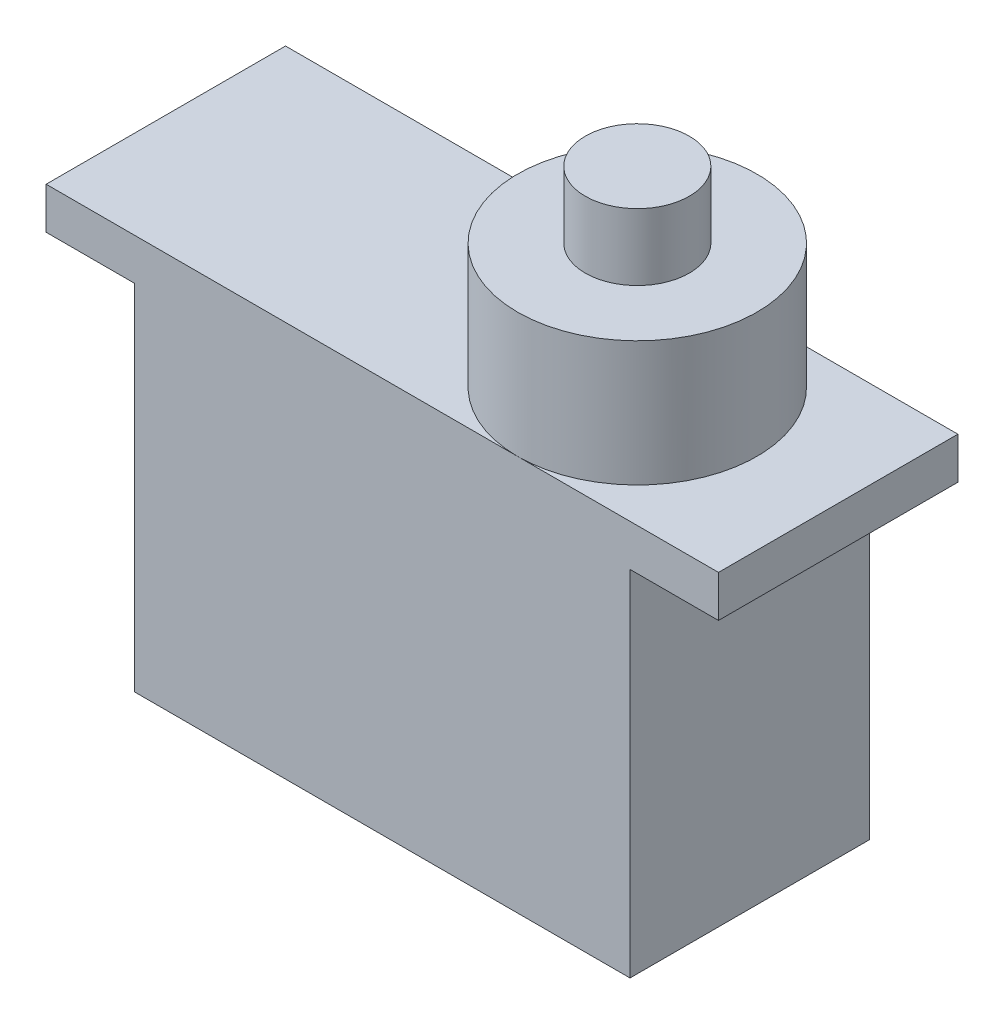
ISO-10303-21;
HEADER;
FILE_DESCRIPTION(('STEP AP214'),'2;1');
FILE_NAME('part.step','',(''),(''),'','','');
FILE_SCHEMA(('AUTOMOTIVE_DESIGN { 1 0 10303 214 1 1 1 1 }'));
ENDSEC;
DATA;
#1=APPLICATION_CONTEXT('core data for automotive mechanical design processes');
#2=APPLICATION_PROTOCOL_DEFINITION('international standard','automotive_design',2000,#1);
#3=PRODUCT_CONTEXT('',#1,'mechanical');
#4=PRODUCT('Part','Part','',(#3));
#5=PRODUCT_RELATED_PRODUCT_CATEGORY('part','',(#4));
#6=PRODUCT_DEFINITION_FORMATION('','',#4);
#7=PRODUCT_DEFINITION_CONTEXT('part definition',#1,'design');
#8=PRODUCT_DEFINITION('design','',#6,#7);
#9=PRODUCT_DEFINITION_SHAPE('','',#8);
#10=(LENGTH_UNIT() NAMED_UNIT(*) SI_UNIT(.MILLI.,.METRE.));
#11=(NAMED_UNIT(*) PLANE_ANGLE_UNIT() SI_UNIT($,.RADIAN.));
#12=(NAMED_UNIT(*) SI_UNIT($,.STERADIAN.) SOLID_ANGLE_UNIT());
#13=UNCERTAINTY_MEASURE_WITH_UNIT(LENGTH_MEASURE(1.E-05),#10,'distance_accuracy_value','');
#14=(GEOMETRIC_REPRESENTATION_CONTEXT(3) GLOBAL_UNCERTAINTY_ASSIGNED_CONTEXT((#13)) GLOBAL_UNIT_ASSIGNED_CONTEXT((#10,
#11,#12)) REPRESENTATION_CONTEXT('',''));
#15=CARTESIAN_POINT('',(0.,0.,0.));
#16=DIRECTION('',(0.,0.,1.));
#17=DIRECTION('',(1.,0.,0.));
#18=AXIS2_PLACEMENT_3D('',#15,#16,#17);
#19=CARTESIAN_POINT('',(0.,19.,0.));
#20=DIRECTION('',(0.,1.,0.));
#21=DIRECTION('',(0.,0.,1.));
#22=AXIS2_PLACEMENT_3D('',#19,#20,#21);
#23=PLANE('',#22);
#24=CARTESIAN_POINT('',(18.4,19.,-5.75));
#25=DIRECTION('',(0.,1.,0.));
#26=DIRECTION('',(0.,0.,1.));
#27=AXIS2_PLACEMENT_3D('',#24,#25,#26);
#28=CIRCLE('',#27,5.75);
#29=CARTESIAN_POINT('',(18.4,19.,0.));
#30=VERTEX_POINT('',#29);
#31=CARTESIAN_POINT('',(18.4,19.,-11.5));
#32=VERTEX_POINT('',#31);
#33=EDGE_CURVE('E139',#30,#32,#28,.T.);
#34=ORIENTED_EDGE('',*,*,#33,.F.);
#35=DIRECTION('',(1.,0.,0.));
#36=VECTOR('',#35,1.);
#37=CARTESIAN_POINT('',(-4.25,19.,0.));
#38=LINE('',#37,#36);
#39=CARTESIAN_POINT('',(28.05,19.,0.));
#40=VERTEX_POINT('',#39);
#41=EDGE_CURVE('E127',#30,#40,#38,.T.);
#42=ORIENTED_EDGE('',*,*,#41,.T.);
#43=DIRECTION('',(0.,0.,-1.));
#44=VECTOR('',#43,1.);
#45=CARTESIAN_POINT('',(28.05,19.,-11.5));
#46=LINE('',#45,#44);
#47=CARTESIAN_POINT('',(28.05,19.,-11.5));
#48=VERTEX_POINT('',#47);
#49=EDGE_CURVE('E126',#40,#48,#46,.T.);
#50=ORIENTED_EDGE('',*,*,#49,.T.);
#51=DIRECTION('',(-1.,0.,0.));
#52=VECTOR('',#51,1.);
#53=CARTESIAN_POINT('',(-4.25,19.,-11.5));
#54=LINE('',#53,#52);
#55=EDGE_CURVE('E141',#48,#32,#54,.T.);
#56=ORIENTED_EDGE('',*,*,#55,.T.);
#57=EDGE_LOOP('',(#34,#42,#50,#56));
#58=FACE_BOUND('',#57,.T.);
#59=ADVANCED_FACE('F39',(#58),#23,.T.);
#60=CARTESIAN_POINT('',(0.,17.,0.));
#61=DIRECTION('',(1.,0.,0.));
#62=DIRECTION('',(0.,0.,-1.));
#63=AXIS2_PLACEMENT_3D('',#60,#61,#62);
#64=PLANE('',#63);
#65=DIRECTION('',(0.,0.,1.));
#66=VECTOR('',#65,1.);
#67=CARTESIAN_POINT('',(0.,0.,0.));
#68=LINE('',#67,#66);
#69=CARTESIAN_POINT('',(0.,0.,-11.5));
#70=VERTEX_POINT('',#69);
#71=CARTESIAN_POINT('',(0.,0.,0.));
#72=VERTEX_POINT('',#71);
#73=EDGE_CURVE('E190',#70,#72,#68,.T.);
#74=ORIENTED_EDGE('',*,*,#73,.T.);
#75=DIRECTION('',(0.,-1.,0.));
#76=VECTOR('',#75,1.);
#77=CARTESIAN_POINT('',(0.,17.,0.));
#78=LINE('',#77,#76);
#79=CARTESIAN_POINT('',(0.,17.,0.));
#80=VERTEX_POINT('',#79);
#81=EDGE_CURVE('E43',#80,#72,#78,.T.);
#82=ORIENTED_EDGE('',*,*,#81,.F.);
#83=DIRECTION('',(0.,0.,1.));
#84=VECTOR('',#83,1.);
#85=CARTESIAN_POINT('',(0.,17.,0.));
#86=LINE('',#85,#84);
#87=CARTESIAN_POINT('',(0.,17.,-11.5));
#88=VERTEX_POINT('',#87);
#89=EDGE_CURVE('E191',#88,#80,#86,.T.);
#90=ORIENTED_EDGE('',*,*,#89,.F.);
#91=DIRECTION('',(0.,-1.,0.));
#92=VECTOR('',#91,1.);
#93=CARTESIAN_POINT('',(0.,17.,-11.5));
#94=LINE('',#93,#92);
#95=EDGE_CURVE('E65',#88,#70,#94,.T.);
#96=ORIENTED_EDGE('',*,*,#95,.T.);
#97=EDGE_LOOP('',(#74,#82,#90,#96));
#98=FACE_BOUND('',#97,.T.);
#99=ADVANCED_FACE('F41',(#98),#64,.F.);
#100=CARTESIAN_POINT('',(0.,17.,0.));
#101=DIRECTION('',(0.,0.,-1.));
#102=DIRECTION('',(-1.,0.,0.));
#103=AXIS2_PLACEMENT_3D('',#100,#101,#102);
#104=PLANE('',#103);
#105=DIRECTION('',(1.,0.,0.));
#106=VECTOR('',#105,1.);
#107=CARTESIAN_POINT('',(0.,0.,0.));
#108=LINE('',#107,#106);
#109=CARTESIAN_POINT('',(23.8,0.,0.));
#110=VERTEX_POINT('',#109);
#111=EDGE_CURVE('E200',#72,#110,#108,.T.);
#112=ORIENTED_EDGE('',*,*,#111,.T.);
#113=DIRECTION('',(0.,-1.,0.));
#114=VECTOR('',#113,1.);
#115=CARTESIAN_POINT('',(23.8,17.,0.));
#116=LINE('',#115,#114);
#117=CARTESIAN_POINT('',(23.8,17.,0.));
#118=VERTEX_POINT('',#117);
#119=EDGE_CURVE('E150',#118,#110,#116,.T.);
#120=ORIENTED_EDGE('',*,*,#119,.F.);
#121=DIRECTION('',(1.,0.,0.));
#122=VECTOR('',#121,1.);
#123=CARTESIAN_POINT('',(-4.25,17.,0.));
#124=LINE('',#123,#122);
#125=CARTESIAN_POINT('',(28.05,17.,0.));
#126=VERTEX_POINT('',#125);
#127=EDGE_CURVE('E166',#118,#126,#124,.T.);
#128=ORIENTED_EDGE('',*,*,#127,.T.);
#129=DIRECTION('',(0.,-1.,0.));
#130=VECTOR('',#129,1.);
#131=CARTESIAN_POINT('',(28.05,19.,0.));
#132=LINE('',#131,#130);
#133=EDGE_CURVE('E133',#40,#126,#132,.T.);
#134=ORIENTED_EDGE('',*,*,#133,.F.);
#135=ORIENTED_EDGE('',*,*,#41,.F.);
#136=CARTESIAN_POINT('',(-4.25,19.,0.));
#137=VERTEX_POINT('',#136);
#138=EDGE_CURVE('E117',#137,#30,#38,.T.);
#139=ORIENTED_EDGE('',*,*,#138,.F.);
#140=DIRECTION('',(0.,-1.,0.));
#141=VECTOR('',#140,1.);
#142=CARTESIAN_POINT('',(-4.25,19.,0.));
#143=LINE('',#142,#141);
#144=CARTESIAN_POINT('',(-4.25,17.,0.));
#145=VERTEX_POINT('',#144);
#146=EDGE_CURVE('E187',#137,#145,#143,.T.);
#147=ORIENTED_EDGE('',*,*,#146,.T.);
#148=EDGE_CURVE('E167',#145,#80,#124,.T.);
#149=ORIENTED_EDGE('',*,*,#148,.T.);
#150=ORIENTED_EDGE('',*,*,#81,.T.);
#151=EDGE_LOOP('',(#112,#120,#128,#134,#135,#139,#147,#149,#150));
#152=FACE_BOUND('',#151,.T.);
#153=ADVANCED_FACE('F131',(#152),#104,.F.);
#154=CARTESIAN_POINT('',(23.8,17.,0.));
#155=DIRECTION('',(-1.,0.,0.));
#156=DIRECTION('',(0.,0.,1.));
#157=AXIS2_PLACEMENT_3D('',#154,#155,#156);
#158=PLANE('',#157);
#159=DIRECTION('',(0.,0.,-1.));
#160=VECTOR('',#159,1.);
#161=CARTESIAN_POINT('',(23.8,0.,0.));
#162=LINE('',#161,#160);
#163=CARTESIAN_POINT('',(23.8,0.,-11.5));
#164=VERTEX_POINT('',#163);
#165=EDGE_CURVE('E203',#110,#164,#162,.T.);
#166=ORIENTED_EDGE('',*,*,#165,.T.);
#167=DIRECTION('',(0.,-1.,0.));
#168=VECTOR('',#167,1.);
#169=CARTESIAN_POINT('',(23.8,17.,-11.5));
#170=LINE('',#169,#168);
#171=CARTESIAN_POINT('',(23.8,17.,-11.5));
#172=VERTEX_POINT('',#171);
#173=EDGE_CURVE('E210',#172,#164,#170,.T.);
#174=ORIENTED_EDGE('',*,*,#173,.F.);
#175=DIRECTION('',(0.,0.,-1.));
#176=VECTOR('',#175,1.);
#177=CARTESIAN_POINT('',(23.8,17.,0.));
#178=LINE('',#177,#176);
#179=EDGE_CURVE('E194',#118,#172,#178,.T.);
#180=ORIENTED_EDGE('',*,*,#179,.F.);
#181=ORIENTED_EDGE('',*,*,#119,.T.);
#182=EDGE_LOOP('',(#166,#174,#180,#181));
#183=FACE_BOUND('',#182,.T.);
#184=ADVANCED_FACE('F217',(#183),#158,.F.);
#185=CARTESIAN_POINT('',(0.,17.,-11.5));
#186=DIRECTION('',(0.,0.,1.));
#187=DIRECTION('',(1.,0.,0.));
#188=AXIS2_PLACEMENT_3D('',#185,#186,#187);
#189=PLANE('',#188);
#190=DIRECTION('',(-1.,0.,0.));
#191=VECTOR('',#190,1.);
#192=CARTESIAN_POINT('',(0.,0.,-11.5));
#193=LINE('',#192,#191);
#194=EDGE_CURVE('E84',#164,#70,#193,.T.);
#195=ORIENTED_EDGE('',*,*,#194,.T.);
#196=ORIENTED_EDGE('',*,*,#95,.F.);
#197=DIRECTION('',(-1.,0.,0.));
#198=VECTOR('',#197,1.);
#199=CARTESIAN_POINT('',(-4.25,17.,-11.5));
#200=LINE('',#199,#198);
#201=CARTESIAN_POINT('',(-4.25,17.,-11.5));
#202=VERTEX_POINT('',#201);
#203=EDGE_CURVE('E174',#88,#202,#200,.T.);
#204=ORIENTED_EDGE('',*,*,#203,.T.);
#205=DIRECTION('',(0.,-1.,0.));
#206=VECTOR('',#205,1.);
#207=CARTESIAN_POINT('',(-4.25,19.,-11.5));
#208=LINE('',#207,#206);
#209=CARTESIAN_POINT('',(-4.25,19.,-11.5));
#210=VERTEX_POINT('',#209);
#211=EDGE_CURVE('E161',#210,#202,#208,.T.);
#212=ORIENTED_EDGE('',*,*,#211,.F.);
#213=EDGE_CURVE('E158',#32,#210,#54,.T.);
#214=ORIENTED_EDGE('',*,*,#213,.F.);
#215=ORIENTED_EDGE('',*,*,#55,.F.);
#216=DIRECTION('',(0.,-1.,0.));
#217=VECTOR('',#216,1.);
#218=CARTESIAN_POINT('',(28.05,19.,-11.5));
#219=LINE('',#218,#217);
#220=CARTESIAN_POINT('',(28.05,17.,-11.5));
#221=VERTEX_POINT('',#220);
#222=EDGE_CURVE('E181',#48,#221,#219,.T.);
#223=ORIENTED_EDGE('',*,*,#222,.T.);
#224=EDGE_CURVE('E154',#221,#172,#200,.T.);
#225=ORIENTED_EDGE('',*,*,#224,.T.);
#226=ORIENTED_EDGE('',*,*,#173,.T.);
#227=EDGE_LOOP('',(#195,#196,#204,#212,#214,#215,#223,#225,#226));
#228=FACE_BOUND('',#227,.T.);
#229=ADVANCED_FACE('F274',(#228),#189,.F.);
#230=CARTESIAN_POINT('',(0.,0.,0.));
#231=DIRECTION('',(0.,-1.,0.));
#232=DIRECTION('',(0.,0.,-1.));
#233=AXIS2_PLACEMENT_3D('',#230,#231,#232);
#234=PLANE('',#233);
#235=ORIENTED_EDGE('',*,*,#73,.F.);
#236=ORIENTED_EDGE('',*,*,#194,.F.);
#237=ORIENTED_EDGE('',*,*,#165,.F.);
#238=ORIENTED_EDGE('',*,*,#111,.F.);
#239=EDGE_LOOP('',(#235,#236,#237,#238));
#240=FACE_BOUND('',#239,.T.);
#241=ADVANCED_FACE('F221',(#240),#234,.T.);
#242=CARTESIAN_POINT('',(0.,17.,0.));
#243=DIRECTION('',(0.,1.,0.));
#244=DIRECTION('',(0.,0.,1.));
#245=AXIS2_PLACEMENT_3D('',#242,#243,#244);
#246=PLANE('',#245);
#247=ORIENTED_EDGE('',*,*,#203,.F.);
#248=ORIENTED_EDGE('',*,*,#89,.T.);
#249=ORIENTED_EDGE('',*,*,#148,.F.);
#250=DIRECTION('',(0.,0.,1.));
#251=VECTOR('',#250,1.);
#252=CARTESIAN_POINT('',(-4.25,17.,-11.5));
#253=LINE('',#252,#251);
#254=EDGE_CURVE('E162',#202,#145,#253,.T.);
#255=ORIENTED_EDGE('',*,*,#254,.F.);
#256=EDGE_LOOP('',(#247,#248,#249,#255));
#257=FACE_BOUND('',#256,.T.);
#258=ADVANCED_FACE('F225',(#257),#246,.F.);
#259=ORIENTED_EDGE('',*,*,#127,.F.);
#260=ORIENTED_EDGE('',*,*,#179,.T.);
#261=ORIENTED_EDGE('',*,*,#224,.F.);
#262=DIRECTION('',(0.,0.,-1.));
#263=VECTOR('',#262,1.);
#264=CARTESIAN_POINT('',(28.05,17.,-11.5));
#265=LINE('',#264,#263);
#266=EDGE_CURVE('E171',#126,#221,#265,.T.);
#267=ORIENTED_EDGE('',*,*,#266,.F.);
#268=EDGE_LOOP('',(#259,#260,#261,#267));
#269=FACE_BOUND('',#268,.T.);
#270=ADVANCED_FACE('F264',(#269),#246,.F.);
#271=CARTESIAN_POINT('',(-4.25,19.,-11.5));
#272=DIRECTION('',(1.,0.,0.));
#273=DIRECTION('',(0.,0.,-1.));
#274=AXIS2_PLACEMENT_3D('',#271,#272,#273);
#275=PLANE('',#274);
#276=ORIENTED_EDGE('',*,*,#254,.T.);
#277=ORIENTED_EDGE('',*,*,#146,.F.);
#278=DIRECTION('',(0.,0.,1.));
#279=VECTOR('',#278,1.);
#280=CARTESIAN_POINT('',(-4.25,19.,-11.5));
#281=LINE('',#280,#279);
#282=EDGE_CURVE('E121',#210,#137,#281,.T.);
#283=ORIENTED_EDGE('',*,*,#282,.F.);
#284=ORIENTED_EDGE('',*,*,#211,.T.);
#285=EDGE_LOOP('',(#276,#277,#283,#284));
#286=FACE_BOUND('',#285,.T.);
#287=ADVANCED_FACE('F267',(#286),#275,.F.);
#288=CARTESIAN_POINT('',(28.05,19.,-11.5));
#289=DIRECTION('',(-1.,0.,0.));
#290=DIRECTION('',(0.,0.,1.));
#291=AXIS2_PLACEMENT_3D('',#288,#289,#290);
#292=PLANE('',#291);
#293=ORIENTED_EDGE('',*,*,#266,.T.);
#294=ORIENTED_EDGE('',*,*,#222,.F.);
#295=ORIENTED_EDGE('',*,*,#49,.F.);
#296=ORIENTED_EDGE('',*,*,#133,.T.);
#297=EDGE_LOOP('',(#293,#294,#295,#296));
#298=FACE_BOUND('',#297,.T.);
#299=ADVANCED_FACE('F255',(#298),#292,.F.);
#300=EDGE_CURVE('E49',#32,#30,#28,.T.);
#301=ORIENTED_EDGE('',*,*,#300,.F.);
#302=ORIENTED_EDGE('',*,*,#213,.T.);
#303=ORIENTED_EDGE('',*,*,#282,.T.);
#304=ORIENTED_EDGE('',*,*,#138,.T.);
#305=EDGE_LOOP('',(#301,#302,#303,#304));
#306=FACE_BOUND('',#305,.T.);
#307=ADVANCED_FACE('F119',(#306),#23,.T.);
#308=CARTESIAN_POINT('',(18.4,25.,-5.75));
#309=DIRECTION('',(0.,-1.,0.));
#310=DIRECTION('',(0.,0.,-1.));
#311=AXIS2_PLACEMENT_3D('',#308,#309,#310);
#312=CYLINDRICAL_SURFACE('',#311,5.75);
#313=CARTESIAN_POINT('',(18.4,25.,-5.75));
#314=DIRECTION('',(0.,1.,0.));
#315=DIRECTION('',(0.,0.,1.));
#316=AXIS2_PLACEMENT_3D('',#313,#314,#315);
#317=CIRCLE('',#316,5.75);
#318=CARTESIAN_POINT('',(18.4,25.,0.));
#319=VERTEX_POINT('',#318);
#320=EDGE_CURVE('E144',#319,#319,#317,.T.);
#321=ORIENTED_EDGE('',*,*,#320,.F.);
#322=EDGE_LOOP('',(#321));
#323=FACE_BOUND('',#322,.T.);
#324=ORIENTED_EDGE('',*,*,#33,.T.);
#325=ORIENTED_EDGE('',*,*,#300,.T.);
#326=EDGE_LOOP('',(#324,#325));
#327=FACE_BOUND('',#326,.T.);
#328=ADVANCED_FACE('F147',(#323,#327),#312,.T.);
#329=CARTESIAN_POINT('',(18.4,25.,-5.75));
#330=DIRECTION('',(0.,1.,0.));
#331=DIRECTION('',(0.,0.,1.));
#332=AXIS2_PLACEMENT_3D('',#329,#330,#331);
#333=PLANE('',#332);
#334=CARTESIAN_POINT('',(18.4,25.,-5.75));
#335=DIRECTION('',(0.,1.,0.));
#336=DIRECTION('',(0.,0.,1.));
#337=AXIS2_PLACEMENT_3D('',#334,#335,#336);
#338=CIRCLE('',#337,2.5);
#339=CARTESIAN_POINT('',(18.4,25.,-3.25));
#340=VERTEX_POINT('',#339);
#341=EDGE_CURVE('E11',#340,#340,#338,.T.);
#342=ORIENTED_EDGE('',*,*,#341,.F.);
#343=EDGE_LOOP('',(#342));
#344=FACE_BOUND('',#343,.T.);
#345=ORIENTED_EDGE('',*,*,#320,.T.);
#346=EDGE_LOOP('',(#345));
#347=FACE_BOUND('',#346,.T.);
#348=ADVANCED_FACE('F241',(#344,#347),#333,.T.);
#349=CARTESIAN_POINT('',(18.4,28.2,-5.75));
#350=DIRECTION('',(0.,-1.,0.));
#351=DIRECTION('',(0.,0.,-1.));
#352=AXIS2_PLACEMENT_3D('',#349,#350,#351);
#353=CYLINDRICAL_SURFACE('',#352,2.5);
#354=CARTESIAN_POINT('',(18.4,28.2,-5.75));
#355=DIRECTION('',(0.,1.,0.));
#356=DIRECTION('',(0.,0.,1.));
#357=AXIS2_PLACEMENT_3D('',#354,#355,#356);
#358=CIRCLE('',#357,2.5);
#359=CARTESIAN_POINT('',(18.4,28.2,-3.25));
#360=VERTEX_POINT('',#359);
#361=EDGE_CURVE('E145',#360,#360,#358,.T.);
#362=ORIENTED_EDGE('',*,*,#361,.F.);
#363=EDGE_LOOP('',(#362));
#364=FACE_BOUND('',#363,.T.);
#365=ORIENTED_EDGE('',*,*,#341,.T.);
#366=EDGE_LOOP('',(#365));
#367=FACE_BOUND('',#366,.T.);
#368=ADVANCED_FACE('F238',(#364,#367),#353,.T.);
#369=CARTESIAN_POINT('',(18.4,28.2,-5.75));
#370=DIRECTION('',(0.,1.,0.));
#371=DIRECTION('',(0.,0.,1.));
#372=AXIS2_PLACEMENT_3D('',#369,#370,#371);
#373=PLANE('',#372);
#374=ORIENTED_EDGE('',*,*,#361,.T.);
#375=EDGE_LOOP('',(#374));
#376=FACE_BOUND('',#375,.T.);
#377=ADVANCED_FACE('F236',(#376),#373,.T.);
#378=CLOSED_SHELL('',(#59,#99,#153,#184,#229,#241,#258,#270,#287,#299,#307,#328,#348,#368,#377));
#379=MANIFOLD_SOLID_BREP('B2',#378);
#380=ADVANCED_BREP_SHAPE_REPRESENTATION('',(#18,#379),#14);
#381=SHAPE_DEFINITION_REPRESENTATION(#9,#380);
ENDSEC;
END-ISO-10303-21;
